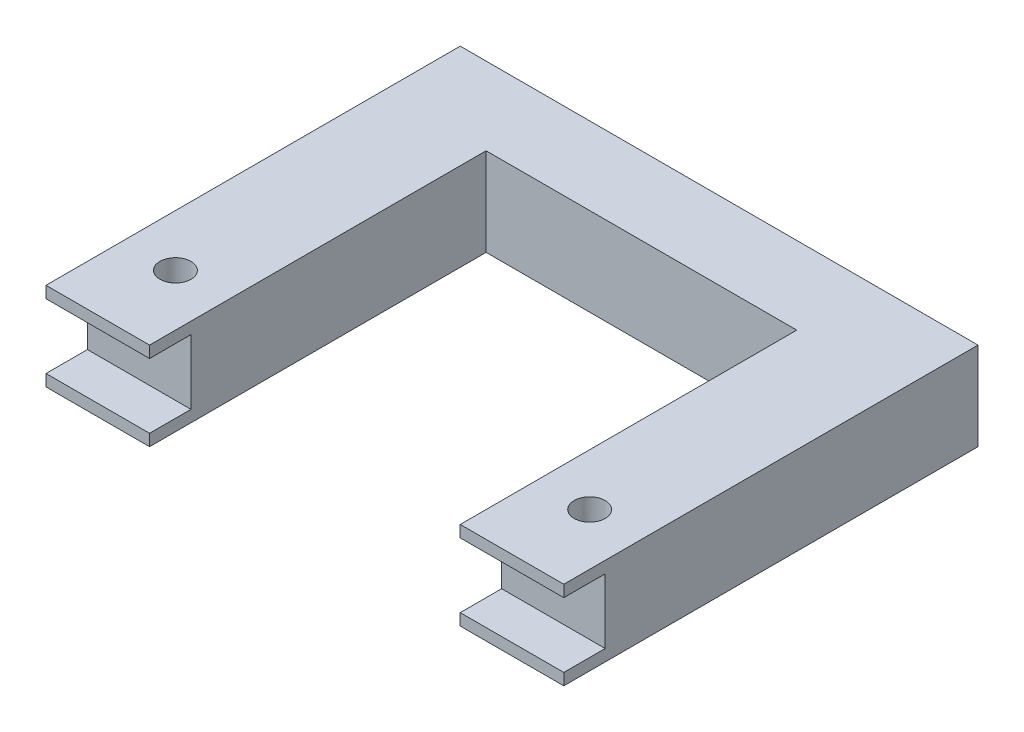
ISO-10303-21;
HEADER;
FILE_DESCRIPTION(('STEP AP214'),'2;1');
FILE_NAME('part.step','',(''),(''),'','','');
FILE_SCHEMA(('AUTOMOTIVE_DESIGN { 1 0 10303 214 1 1 1 1 }'));
ENDSEC;
DATA;
#1=APPLICATION_CONTEXT('core data for automotive mechanical design processes');
#2=APPLICATION_PROTOCOL_DEFINITION('international standard','automotive_design',2000,#1);
#3=PRODUCT_CONTEXT('',#1,'mechanical');
#4=PRODUCT('Part','Part','',(#3));
#5=PRODUCT_RELATED_PRODUCT_CATEGORY('part','',(#4));
#6=PRODUCT_DEFINITION_FORMATION('','',#4);
#7=PRODUCT_DEFINITION_CONTEXT('part definition',#1,'design');
#8=PRODUCT_DEFINITION('design','',#6,#7);
#9=PRODUCT_DEFINITION_SHAPE('','',#8);
#10=(LENGTH_UNIT() NAMED_UNIT(*) SI_UNIT(.MILLI.,.METRE.));
#11=(NAMED_UNIT(*) PLANE_ANGLE_UNIT() SI_UNIT($,.RADIAN.));
#12=(NAMED_UNIT(*) SI_UNIT($,.STERADIAN.) SOLID_ANGLE_UNIT());
#13=UNCERTAINTY_MEASURE_WITH_UNIT(LENGTH_MEASURE(1.E-05),#10,'distance_accuracy_value','');
#14=(GEOMETRIC_REPRESENTATION_CONTEXT(3) GLOBAL_UNCERTAINTY_ASSIGNED_CONTEXT((#13)) GLOBAL_UNIT_ASSIGNED_CONTEXT((#10,
#11,#12)) REPRESENTATION_CONTEXT('',''));
#15=CARTESIAN_POINT('',(0.,0.,0.));
#16=DIRECTION('',(0.,0.,1.));
#17=DIRECTION('',(1.,0.,0.));
#18=AXIS2_PLACEMENT_3D('',#15,#16,#17);
#19=CARTESIAN_POINT('',(80.,17.,0.));
#20=DIRECTION('',(0.,0.,-1.));
#21=DIRECTION('',(-1.,0.,0.));
#22=AXIS2_PLACEMENT_3D('',#19,#20,#21);
#23=PLANE('',#22);
#24=DIRECTION('',(0.,-1.,0.));
#25=VECTOR('',#24,1.);
#26=CARTESIAN_POINT('',(60.,17.,0.));
#27=LINE('',#26,#25);
#28=CARTESIAN_POINT('',(60.,17.,0.));
#29=VERTEX_POINT('',#28);
#30=CARTESIAN_POINT('',(60.,14.75,0.));
#31=VERTEX_POINT('',#30);
#32=EDGE_CURVE('E247',#29,#31,#27,.T.);
#33=ORIENTED_EDGE('',*,*,#32,.T.);
#34=DIRECTION('',(-1.,0.,0.));
#35=VECTOR('',#34,1.);
#36=CARTESIAN_POINT('',(-20.,14.75,0.));
#37=LINE('',#36,#35);
#38=CARTESIAN_POINT('',(80.,14.75,0.));
#39=VERTEX_POINT('',#38);
#40=EDGE_CURVE('E163',#39,#31,#37,.T.);
#41=ORIENTED_EDGE('',*,*,#40,.F.);
#42=DIRECTION('',(0.,-1.,0.));
#43=VECTOR('',#42,1.);
#44=CARTESIAN_POINT('',(80.,17.,0.));
#45=LINE('',#44,#43);
#46=CARTESIAN_POINT('',(80.,17.,0.));
#47=VERTEX_POINT('',#46);
#48=EDGE_CURVE('E243',#47,#39,#45,.T.);
#49=ORIENTED_EDGE('',*,*,#48,.F.);
#50=DIRECTION('',(1.,0.,0.));
#51=VECTOR('',#50,1.);
#52=CARTESIAN_POINT('',(80.,17.,0.));
#53=LINE('',#52,#51);
#54=EDGE_CURVE('E201',#29,#47,#53,.T.);
#55=ORIENTED_EDGE('',*,*,#54,.F.);
#56=EDGE_LOOP('',(#33,#41,#49,#55));
#57=FACE_BOUND('',#56,.T.);
#58=ADVANCED_FACE('F33',(#57),#23,.F.);
#59=CARTESIAN_POINT('',(0.,17.,0.));
#60=DIRECTION('',(0.,0.,-1.));
#61=DIRECTION('',(-1.,0.,0.));
#62=AXIS2_PLACEMENT_3D('',#59,#60,#61);
#63=PLANE('',#62);
#64=DIRECTION('',(0.,-1.,0.));
#65=VECTOR('',#64,1.);
#66=CARTESIAN_POINT('',(-20.,17.,0.));
#67=LINE('',#66,#65);
#68=CARTESIAN_POINT('',(-20.,17.,0.));
#69=VERTEX_POINT('',#68);
#70=CARTESIAN_POINT('',(-20.,14.75,0.));
#71=VERTEX_POINT('',#70);
#72=EDGE_CURVE('E233',#69,#71,#67,.T.);
#73=ORIENTED_EDGE('',*,*,#72,.T.);
#74=DIRECTION('',(1.,0.,0.));
#75=VECTOR('',#74,1.);
#76=CARTESIAN_POINT('',(0.,14.75,0.));
#77=LINE('',#76,#75);
#78=CARTESIAN_POINT('',(0.,14.75,0.));
#79=VERTEX_POINT('',#78);
#80=EDGE_CURVE('E11',#71,#79,#77,.T.);
#81=ORIENTED_EDGE('',*,*,#80,.T.);
#82=DIRECTION('',(0.,-1.,0.));
#83=VECTOR('',#82,1.);
#84=CARTESIAN_POINT('',(0.,17.,0.));
#85=LINE('',#84,#83);
#86=CARTESIAN_POINT('',(0.,17.,0.));
#87=VERTEX_POINT('',#86);
#88=EDGE_CURVE('E230',#87,#79,#85,.T.);
#89=ORIENTED_EDGE('',*,*,#88,.F.);
#90=DIRECTION('',(1.,0.,0.));
#91=VECTOR('',#90,1.);
#92=CARTESIAN_POINT('',(0.,17.,0.));
#93=LINE('',#92,#91);
#94=EDGE_CURVE('E209',#69,#87,#93,.T.);
#95=ORIENTED_EDGE('',*,*,#94,.F.);
#96=EDGE_LOOP('',(#73,#81,#89,#95));
#97=FACE_BOUND('',#96,.T.);
#98=ADVANCED_FACE('F281',(#97),#63,.F.);
#99=CARTESIAN_POINT('',(0.,17.,-65.));
#100=DIRECTION('',(-1.,0.,0.));
#101=DIRECTION('',(0.,0.,1.));
#102=AXIS2_PLACEMENT_3D('',#99,#100,#101);
#103=PLANE('',#102);
#104=ORIENTED_EDGE('',*,*,#88,.T.);
#105=DIRECTION('',(0.,0.,-1.));
#106=VECTOR('',#105,1.);
#107=CARTESIAN_POINT('',(0.,14.75,-65.));
#108=LINE('',#107,#106);
#109=CARTESIAN_POINT('',(0.,14.75,-8.));
#110=VERTEX_POINT('',#109);
#111=EDGE_CURVE('E185',#79,#110,#108,.T.);
#112=ORIENTED_EDGE('',*,*,#111,.T.);
#113=DIRECTION('',(0.,1.,0.));
#114=VECTOR('',#113,1.);
#115=CARTESIAN_POINT('',(0.,17.,-8.));
#116=LINE('',#115,#114);
#117=CARTESIAN_POINT('',(0.,2.25,-8.));
#118=VERTEX_POINT('',#117);
#119=EDGE_CURVE('E190',#118,#110,#116,.T.);
#120=ORIENTED_EDGE('',*,*,#119,.F.);
#121=DIRECTION('',(0.,0.,1.));
#122=VECTOR('',#121,1.);
#123=CARTESIAN_POINT('',(0.,2.25,-65.));
#124=LINE('',#123,#122);
#125=CARTESIAN_POINT('',(0.,2.25,0.));
#126=VERTEX_POINT('',#125);
#127=EDGE_CURVE('E149',#118,#126,#124,.T.);
#128=ORIENTED_EDGE('',*,*,#127,.T.);
#129=CARTESIAN_POINT('',(0.,0.,0.));
#130=VERTEX_POINT('',#129);
#131=EDGE_CURVE('E211',#126,#130,#85,.T.);
#132=ORIENTED_EDGE('',*,*,#131,.T.);
#133=DIRECTION('',(0.,0.,-1.));
#134=VECTOR('',#133,1.);
#135=CARTESIAN_POINT('',(0.,0.,-65.));
#136=LINE('',#135,#134);
#137=CARTESIAN_POINT('',(0.,0.,-65.));
#138=VERTEX_POINT('',#137);
#139=EDGE_CURVE('E192',#130,#138,#136,.T.);
#140=ORIENTED_EDGE('',*,*,#139,.T.);
#141=DIRECTION('',(0.,-1.,0.));
#142=VECTOR('',#141,1.);
#143=CARTESIAN_POINT('',(0.,17.,-65.));
#144=LINE('',#143,#142);
#145=CARTESIAN_POINT('',(0.,17.,-65.));
#146=VERTEX_POINT('',#145);
#147=EDGE_CURVE('E41',#146,#138,#144,.T.);
#148=ORIENTED_EDGE('',*,*,#147,.F.);
#149=DIRECTION('',(0.,0.,-1.));
#150=VECTOR('',#149,1.);
#151=CARTESIAN_POINT('',(0.,17.,-65.));
#152=LINE('',#151,#150);
#153=EDGE_CURVE('E193',#87,#146,#152,.T.);
#154=ORIENTED_EDGE('',*,*,#153,.F.);
#155=EDGE_LOOP('',(#104,#112,#120,#128,#132,#140,#148,#154));
#156=FACE_BOUND('',#155,.T.);
#157=ADVANCED_FACE('F35',(#156),#103,.F.);
#158=CARTESIAN_POINT('',(60.,17.,-65.));
#159=DIRECTION('',(0.,0.,-1.));
#160=DIRECTION('',(-1.,0.,0.));
#161=AXIS2_PLACEMENT_3D('',#158,#159,#160);
#162=PLANE('',#161);
#163=DIRECTION('',(1.,0.,0.));
#164=VECTOR('',#163,1.);
#165=CARTESIAN_POINT('',(60.,0.,-65.));
#166=LINE('',#165,#164);
#167=CARTESIAN_POINT('',(60.,0.,-65.));
#168=VERTEX_POINT('',#167);
#169=EDGE_CURVE('E214',#138,#168,#166,.T.);
#170=ORIENTED_EDGE('',*,*,#169,.T.);
#171=DIRECTION('',(0.,-1.,0.));
#172=VECTOR('',#171,1.);
#173=CARTESIAN_POINT('',(60.,17.,-65.));
#174=LINE('',#173,#172);
#175=CARTESIAN_POINT('',(60.,17.,-65.));
#176=VERTEX_POINT('',#175);
#177=EDGE_CURVE('E250',#176,#168,#174,.T.);
#178=ORIENTED_EDGE('',*,*,#177,.F.);
#179=DIRECTION('',(1.,0.,0.));
#180=VECTOR('',#179,1.);
#181=CARTESIAN_POINT('',(60.,17.,-65.));
#182=LINE('',#181,#180);
#183=EDGE_CURVE('E196',#146,#176,#182,.T.);
#184=ORIENTED_EDGE('',*,*,#183,.F.);
#185=ORIENTED_EDGE('',*,*,#147,.T.);
#186=EDGE_LOOP('',(#170,#178,#184,#185));
#187=FACE_BOUND('',#186,.T.);
#188=ADVANCED_FACE('F255',(#187),#162,.F.);
#189=CARTESIAN_POINT('',(60.,17.,0.));
#190=DIRECTION('',(1.,0.,0.));
#191=DIRECTION('',(0.,0.,-1.));
#192=AXIS2_PLACEMENT_3D('',#189,#190,#191);
#193=PLANE('',#192);
#194=DIRECTION('',(0.,-1.,0.));
#195=VECTOR('',#194,1.);
#196=CARTESIAN_POINT('',(60.,17.,-8.));
#197=LINE('',#196,#195);
#198=CARTESIAN_POINT('',(60.,14.75,-8.));
#199=VERTEX_POINT('',#198);
#200=CARTESIAN_POINT('',(60.,2.25,-8.));
#201=VERTEX_POINT('',#200);
#202=EDGE_CURVE('E188',#199,#201,#197,.T.);
#203=ORIENTED_EDGE('',*,*,#202,.F.);
#204=DIRECTION('',(0.,0.,1.));
#205=VECTOR('',#204,1.);
#206=CARTESIAN_POINT('',(60.,14.75,0.));
#207=LINE('',#206,#205);
#208=EDGE_CURVE('E182',#199,#31,#207,.T.);
#209=ORIENTED_EDGE('',*,*,#208,.T.);
#210=ORIENTED_EDGE('',*,*,#32,.F.);
#211=DIRECTION('',(0.,0.,1.));
#212=VECTOR('',#211,1.);
#213=CARTESIAN_POINT('',(60.,17.,0.));
#214=LINE('',#213,#212);
#215=EDGE_CURVE('E199',#176,#29,#214,.T.);
#216=ORIENTED_EDGE('',*,*,#215,.F.);
#217=ORIENTED_EDGE('',*,*,#177,.T.);
#218=DIRECTION('',(0.,0.,1.));
#219=VECTOR('',#218,1.);
#220=CARTESIAN_POINT('',(60.,0.,0.));
#221=LINE('',#220,#219);
#222=CARTESIAN_POINT('',(60.,0.,0.));
#223=VERTEX_POINT('',#222);
#224=EDGE_CURVE('E216',#168,#223,#221,.T.);
#225=ORIENTED_EDGE('',*,*,#224,.T.);
#226=CARTESIAN_POINT('',(60.,2.25,0.));
#227=VERTEX_POINT('',#226);
#228=EDGE_CURVE('E246',#227,#223,#27,.T.);
#229=ORIENTED_EDGE('',*,*,#228,.F.);
#230=DIRECTION('',(0.,0.,-1.));
#231=VECTOR('',#230,1.);
#232=CARTESIAN_POINT('',(60.,2.25,0.));
#233=LINE('',#232,#231);
#234=EDGE_CURVE('E177',#227,#201,#233,.T.);
#235=ORIENTED_EDGE('',*,*,#234,.T.);
#236=EDGE_LOOP('',(#203,#209,#210,#216,#217,#225,#229,#235));
#237=FACE_BOUND('',#236,.T.);
#238=ADVANCED_FACE('F271',(#237),#193,.F.);
#239=CARTESIAN_POINT('',(80.,2.25,0.));
#240=VERTEX_POINT('',#239);
#241=CARTESIAN_POINT('',(80.,0.,0.));
#242=VERTEX_POINT('',#241);
#243=EDGE_CURVE('E242',#240,#242,#45,.T.);
#244=ORIENTED_EDGE('',*,*,#243,.F.);
#245=DIRECTION('',(1.,0.,0.));
#246=VECTOR('',#245,1.);
#247=CARTESIAN_POINT('',(-20.,2.25,0.));
#248=LINE('',#247,#246);
#249=EDGE_CURVE('E290',#227,#240,#248,.T.);
#250=ORIENTED_EDGE('',*,*,#249,.F.);
#251=ORIENTED_EDGE('',*,*,#228,.T.);
#252=DIRECTION('',(1.,0.,0.));
#253=VECTOR('',#252,1.);
#254=CARTESIAN_POINT('',(80.,0.,0.));
#255=LINE('',#254,#253);
#256=EDGE_CURVE('E219',#223,#242,#255,.T.);
#257=ORIENTED_EDGE('',*,*,#256,.T.);
#258=EDGE_LOOP('',(#244,#250,#251,#257));
#259=FACE_BOUND('',#258,.T.);
#260=ADVANCED_FACE('F334',(#259),#23,.F.);
#261=CARTESIAN_POINT('',(80.,17.,-80.));
#262=DIRECTION('',(-1.,0.,0.));
#263=DIRECTION('',(0.,0.,1.));
#264=AXIS2_PLACEMENT_3D('',#261,#262,#263);
#265=PLANE('',#264);
#266=ORIENTED_EDGE('',*,*,#48,.T.);
#267=DIRECTION('',(0.,0.,1.));
#268=VECTOR('',#267,1.);
#269=CARTESIAN_POINT('',(80.,14.75,-8.));
#270=LINE('',#269,#268);
#271=CARTESIAN_POINT('',(80.,14.75,-8.));
#272=VERTEX_POINT('',#271);
#273=EDGE_CURVE('E171',#272,#39,#270,.T.);
#274=ORIENTED_EDGE('',*,*,#273,.F.);
#275=DIRECTION('',(0.,1.,0.));
#276=VECTOR('',#275,1.);
#277=CARTESIAN_POINT('',(80.,14.75,-8.));
#278=LINE('',#277,#276);
#279=CARTESIAN_POINT('',(80.,2.25,-7.99999999999999));
#280=VERTEX_POINT('',#279);
#281=EDGE_CURVE('E152',#280,#272,#278,.T.);
#282=ORIENTED_EDGE('',*,*,#281,.F.);
#283=DIRECTION('',(0.,0.,1.));
#284=VECTOR('',#283,1.);
#285=CARTESIAN_POINT('',(80.,2.25,-8.));
#286=LINE('',#285,#284);
#287=EDGE_CURVE('E48',#280,#240,#286,.T.);
#288=ORIENTED_EDGE('',*,*,#287,.T.);
#289=ORIENTED_EDGE('',*,*,#243,.T.);
#290=DIRECTION('',(0.,0.,-1.));
#291=VECTOR('',#290,1.);
#292=CARTESIAN_POINT('',(80.,0.,-80.));
#293=LINE('',#292,#291);
#294=CARTESIAN_POINT('',(80.,0.,-80.));
#295=VERTEX_POINT('',#294);
#296=EDGE_CURVE('E222',#242,#295,#293,.T.);
#297=ORIENTED_EDGE('',*,*,#296,.T.);
#298=DIRECTION('',(0.,-1.,0.));
#299=VECTOR('',#298,1.);
#300=CARTESIAN_POINT('',(80.,17.,-80.));
#301=LINE('',#300,#299);
#302=CARTESIAN_POINT('',(80.,17.,-80.));
#303=VERTEX_POINT('',#302);
#304=EDGE_CURVE('E239',#303,#295,#301,.T.);
#305=ORIENTED_EDGE('',*,*,#304,.F.);
#306=DIRECTION('',(0.,0.,-1.));
#307=VECTOR('',#306,1.);
#308=CARTESIAN_POINT('',(80.,17.,-80.));
#309=LINE('',#308,#307);
#310=EDGE_CURVE('E203',#47,#303,#309,.T.);
#311=ORIENTED_EDGE('',*,*,#310,.F.);
#312=EDGE_LOOP('',(#266,#274,#282,#288,#289,#297,#305,#311));
#313=FACE_BOUND('',#312,.T.);
#314=ADVANCED_FACE('F341',(#313),#265,.F.);
#315=CARTESIAN_POINT('',(-20.,17.,-80.));
#316=DIRECTION('',(0.,0.,1.));
#317=DIRECTION('',(1.,0.,0.));
#318=AXIS2_PLACEMENT_3D('',#315,#316,#317);
#319=PLANE('',#318);
#320=DIRECTION('',(-1.,0.,0.));
#321=VECTOR('',#320,1.);
#322=CARTESIAN_POINT('',(-20.,0.,-80.));
#323=LINE('',#322,#321);
#324=CARTESIAN_POINT('',(-20.,0.,-80.));
#325=VERTEX_POINT('',#324);
#326=EDGE_CURVE('E224',#295,#325,#323,.T.);
#327=ORIENTED_EDGE('',*,*,#326,.T.);
#328=DIRECTION('',(0.,-1.,0.));
#329=VECTOR('',#328,1.);
#330=CARTESIAN_POINT('',(-20.,17.,-80.));
#331=LINE('',#330,#329);
#332=CARTESIAN_POINT('',(-20.,17.,-80.));
#333=VERTEX_POINT('',#332);
#334=EDGE_CURVE('E236',#333,#325,#331,.T.);
#335=ORIENTED_EDGE('',*,*,#334,.F.);
#336=DIRECTION('',(-1.,0.,0.));
#337=VECTOR('',#336,1.);
#338=CARTESIAN_POINT('',(-20.,17.,-80.));
#339=LINE('',#338,#337);
#340=EDGE_CURVE('E205',#303,#333,#339,.T.);
#341=ORIENTED_EDGE('',*,*,#340,.F.);
#342=ORIENTED_EDGE('',*,*,#304,.T.);
#343=EDGE_LOOP('',(#327,#335,#341,#342));
#344=FACE_BOUND('',#343,.T.);
#345=ADVANCED_FACE('F347',(#344),#319,.F.);
#346=CARTESIAN_POINT('',(-20.,17.,0.));
#347=DIRECTION('',(1.,0.,0.));
#348=DIRECTION('',(0.,0.,-1.));
#349=AXIS2_PLACEMENT_3D('',#346,#347,#348);
#350=PLANE('',#349);
#351=DIRECTION('',(0.,-1.,0.));
#352=VECTOR('',#351,1.);
#353=CARTESIAN_POINT('',(-20.,14.75,-8.));
#354=LINE('',#353,#352);
#355=CARTESIAN_POINT('',(-20.,14.75,-8.));
#356=VERTEX_POINT('',#355);
#357=CARTESIAN_POINT('',(-20.,2.25,-8.));
#358=VERTEX_POINT('',#357);
#359=EDGE_CURVE('E156',#356,#358,#354,.T.);
#360=ORIENTED_EDGE('',*,*,#359,.F.);
#361=DIRECTION('',(0.,0.,1.));
#362=VECTOR('',#361,1.);
#363=CARTESIAN_POINT('',(-20.,14.75,-8.));
#364=LINE('',#363,#362);
#365=EDGE_CURVE('E180',#356,#71,#364,.T.);
#366=ORIENTED_EDGE('',*,*,#365,.T.);
#367=ORIENTED_EDGE('',*,*,#72,.F.);
#368=DIRECTION('',(0.,0.,1.));
#369=VECTOR('',#368,1.);
#370=CARTESIAN_POINT('',(-20.,17.,0.));
#371=LINE('',#370,#369);
#372=EDGE_CURVE('E207',#333,#69,#371,.T.);
#373=ORIENTED_EDGE('',*,*,#372,.F.);
#374=ORIENTED_EDGE('',*,*,#334,.T.);
#375=DIRECTION('',(0.,0.,1.));
#376=VECTOR('',#375,1.);
#377=CARTESIAN_POINT('',(-20.,0.,0.));
#378=LINE('',#377,#376);
#379=CARTESIAN_POINT('',(-20.,0.,0.));
#380=VERTEX_POINT('',#379);
#381=EDGE_CURVE('E226',#325,#380,#378,.T.);
#382=ORIENTED_EDGE('',*,*,#381,.T.);
#383=CARTESIAN_POINT('',(-20.,2.25,0.));
#384=VERTEX_POINT('',#383);
#385=EDGE_CURVE('E168',#384,#380,#67,.T.);
#386=ORIENTED_EDGE('',*,*,#385,.F.);
#387=DIRECTION('',(0.,0.,1.));
#388=VECTOR('',#387,1.);
#389=CARTESIAN_POINT('',(-20.,2.25,-8.));
#390=LINE('',#389,#388);
#391=EDGE_CURVE('E56',#358,#384,#390,.T.);
#392=ORIENTED_EDGE('',*,*,#391,.F.);
#393=EDGE_LOOP('',(#360,#366,#367,#373,#374,#382,#386,#392));
#394=FACE_BOUND('',#393,.T.);
#395=ADVANCED_FACE('F166',(#394),#350,.F.);
#396=ORIENTED_EDGE('',*,*,#131,.F.);
#397=EDGE_CURVE('E289',#384,#126,#248,.T.);
#398=ORIENTED_EDGE('',*,*,#397,.F.);
#399=ORIENTED_EDGE('',*,*,#385,.T.);
#400=DIRECTION('',(1.,0.,0.));
#401=VECTOR('',#400,1.);
#402=CARTESIAN_POINT('',(0.,0.,0.));
#403=LINE('',#402,#401);
#404=EDGE_CURVE('E197',#380,#130,#403,.T.);
#405=ORIENTED_EDGE('',*,*,#404,.T.);
#406=EDGE_LOOP('',(#396,#398,#399,#405));
#407=FACE_BOUND('',#406,.T.);
#408=ADVANCED_FACE('F311',(#407),#63,.F.);
#409=CARTESIAN_POINT('',(0.,17.,0.));
#410=DIRECTION('',(0.,-1.,0.));
#411=DIRECTION('',(0.,0.,-1.));
#412=AXIS2_PLACEMENT_3D('',#409,#410,#411);
#413=PLANE('',#412);
#414=CARTESIAN_POINT('',(-10.,17.,-15.));
#415=DIRECTION('',(0.,1.,0.));
#416=DIRECTION('',(0.,0.,1.));
#417=AXIS2_PLACEMENT_3D('',#414,#415,#416);
#418=CIRCLE('',#417,3.);
#419=CARTESIAN_POINT('',(-10.,17.,-12.));
#420=VERTEX_POINT('',#419);
#421=EDGE_CURVE('E296',#420,#420,#418,.T.);
#422=ORIENTED_EDGE('',*,*,#421,.F.);
#423=EDGE_LOOP('',(#422));
#424=FACE_BOUND('',#423,.T.);
#425=CARTESIAN_POINT('',(70.,17.,-15.));
#426=DIRECTION('',(0.,1.,0.));
#427=DIRECTION('',(0.,0.,1.));
#428=AXIS2_PLACEMENT_3D('',#425,#426,#427);
#429=CIRCLE('',#428,3.00000000000001);
#430=CARTESIAN_POINT('',(70.,17.,-12.));
#431=VERTEX_POINT('',#430);
#432=EDGE_CURVE('E297',#431,#431,#429,.T.);
#433=ORIENTED_EDGE('',*,*,#432,.F.);
#434=EDGE_LOOP('',(#433));
#435=FACE_BOUND('',#434,.T.);
#436=ORIENTED_EDGE('',*,*,#153,.T.);
#437=ORIENTED_EDGE('',*,*,#183,.T.);
#438=ORIENTED_EDGE('',*,*,#215,.T.);
#439=ORIENTED_EDGE('',*,*,#54,.T.);
#440=ORIENTED_EDGE('',*,*,#310,.T.);
#441=ORIENTED_EDGE('',*,*,#340,.T.);
#442=ORIENTED_EDGE('',*,*,#372,.T.);
#443=ORIENTED_EDGE('',*,*,#94,.T.);
#444=EDGE_LOOP('',(#436,#437,#438,#439,#440,#441,#442,#443));
#445=FACE_BOUND('',#444,.T.);
#446=ADVANCED_FACE('F276',(#424,#435,#445),#413,.F.);
#447=CARTESIAN_POINT('',(0.,0.,0.));
#448=DIRECTION('',(0.,-1.,0.));
#449=DIRECTION('',(0.,0.,-1.));
#450=AXIS2_PLACEMENT_3D('',#447,#448,#449);
#451=PLANE('',#450);
#452=CARTESIAN_POINT('',(-10.,0.,-15.));
#453=DIRECTION('',(0.,-1.,0.));
#454=DIRECTION('',(0.,0.,-1.));
#455=AXIS2_PLACEMENT_3D('',#452,#453,#454);
#456=CIRCLE('',#455,3.);
#457=CARTESIAN_POINT('',(-10.,0.,-18.));
#458=VERTEX_POINT('',#457);
#459=EDGE_CURVE('E300',#458,#458,#456,.F.);
#460=ORIENTED_EDGE('',*,*,#459,.T.);
#461=EDGE_LOOP('',(#460));
#462=FACE_BOUND('',#461,.T.);
#463=CARTESIAN_POINT('',(70.,0.,-15.));
#464=DIRECTION('',(0.,-1.,0.));
#465=DIRECTION('',(0.,0.,-1.));
#466=AXIS2_PLACEMENT_3D('',#463,#464,#465);
#467=CIRCLE('',#466,3.00000000000001);
#468=CARTESIAN_POINT('',(70.,0.,-18.));
#469=VERTEX_POINT('',#468);
#470=EDGE_CURVE('E293',#469,#469,#467,.F.);
#471=ORIENTED_EDGE('',*,*,#470,.T.);
#472=EDGE_LOOP('',(#471));
#473=FACE_BOUND('',#472,.T.);
#474=ORIENTED_EDGE('',*,*,#139,.F.);
#475=ORIENTED_EDGE('',*,*,#404,.F.);
#476=ORIENTED_EDGE('',*,*,#381,.F.);
#477=ORIENTED_EDGE('',*,*,#326,.F.);
#478=ORIENTED_EDGE('',*,*,#296,.F.);
#479=ORIENTED_EDGE('',*,*,#256,.F.);
#480=ORIENTED_EDGE('',*,*,#224,.F.);
#481=ORIENTED_EDGE('',*,*,#169,.F.);
#482=EDGE_LOOP('',(#474,#475,#476,#477,#478,#479,#480,#481));
#483=FACE_BOUND('',#482,.T.);
#484=ADVANCED_FACE('F263',(#462,#473,#483),#451,.T.);
#485=CARTESIAN_POINT('',(-20.,14.75,-8.));
#486=DIRECTION('',(0.,1.,0.));
#487=DIRECTION('',(0.,0.,1.));
#488=AXIS2_PLACEMENT_3D('',#485,#486,#487);
#489=PLANE('',#488);
#490=ORIENTED_EDGE('',*,*,#80,.F.);
#491=ORIENTED_EDGE('',*,*,#365,.F.);
#492=DIRECTION('',(-1.,0.,0.));
#493=VECTOR('',#492,1.);
#494=CARTESIAN_POINT('',(-20.,14.75,-8.));
#495=LINE('',#494,#493);
#496=EDGE_CURVE('E159',#110,#356,#495,.T.);
#497=ORIENTED_EDGE('',*,*,#496,.F.);
#498=ORIENTED_EDGE('',*,*,#111,.F.);
#499=EDGE_LOOP('',(#490,#491,#497,#498));
#500=FACE_BOUND('',#499,.T.);
#501=ADVANCED_FACE('F284',(#500),#489,.F.);
#502=CARTESIAN_POINT('',(-20.,2.25,-8.));
#503=DIRECTION('',(0.,-1.,0.));
#504=DIRECTION('',(0.,0.,-1.));
#505=AXIS2_PLACEMENT_3D('',#502,#503,#504);
#506=PLANE('',#505);
#507=DIRECTION('',(1.,0.,0.));
#508=VECTOR('',#507,1.);
#509=CARTESIAN_POINT('',(-20.,2.25,-8.));
#510=LINE('',#509,#508);
#511=EDGE_CURVE('E145',#358,#118,#510,.T.);
#512=ORIENTED_EDGE('',*,*,#511,.F.);
#513=ORIENTED_EDGE('',*,*,#391,.T.);
#514=ORIENTED_EDGE('',*,*,#397,.T.);
#515=ORIENTED_EDGE('',*,*,#127,.F.);
#516=EDGE_LOOP('',(#512,#513,#514,#515));
#517=FACE_BOUND('',#516,.T.);
#518=ADVANCED_FACE('F147',(#517),#506,.F.);
#519=CARTESIAN_POINT('',(0.,0.,-8.));
#520=DIRECTION('',(0.,0.,1.));
#521=DIRECTION('',(1.,0.,0.));
#522=AXIS2_PLACEMENT_3D('',#519,#520,#521);
#523=PLANE('',#522);
#524=ORIENTED_EDGE('',*,*,#119,.T.);
#525=ORIENTED_EDGE('',*,*,#496,.T.);
#526=ORIENTED_EDGE('',*,*,#359,.T.);
#527=ORIENTED_EDGE('',*,*,#511,.T.);
#528=EDGE_LOOP('',(#524,#525,#526,#527));
#529=FACE_BOUND('',#528,.T.);
#530=ADVANCED_FACE('F157',(#529),#523,.T.);
#531=ORIENTED_EDGE('',*,*,#202,.T.);
#532=EDGE_CURVE('E153',#201,#280,#510,.T.);
#533=ORIENTED_EDGE('',*,*,#532,.T.);
#534=ORIENTED_EDGE('',*,*,#281,.T.);
#535=EDGE_CURVE('E169',#272,#199,#495,.T.);
#536=ORIENTED_EDGE('',*,*,#535,.T.);
#537=EDGE_LOOP('',(#531,#533,#534,#536));
#538=FACE_BOUND('',#537,.T.);
#539=ADVANCED_FACE('F356',(#538),#523,.T.);
#540=ORIENTED_EDGE('',*,*,#535,.F.);
#541=ORIENTED_EDGE('',*,*,#273,.T.);
#542=ORIENTED_EDGE('',*,*,#40,.T.);
#543=ORIENTED_EDGE('',*,*,#208,.F.);
#544=EDGE_LOOP('',(#540,#541,#542,#543));
#545=FACE_BOUND('',#544,.T.);
#546=ADVANCED_FACE('F329',(#545),#489,.F.);
#547=ORIENTED_EDGE('',*,*,#249,.T.);
#548=ORIENTED_EDGE('',*,*,#287,.F.);
#549=ORIENTED_EDGE('',*,*,#532,.F.);
#550=ORIENTED_EDGE('',*,*,#234,.F.);
#551=EDGE_LOOP('',(#547,#548,#549,#550));
#552=FACE_BOUND('',#551,.T.);
#553=ADVANCED_FACE('F318',(#552),#506,.F.);
#554=CARTESIAN_POINT('',(70.,-8.48528137423859,-15.));
#555=DIRECTION('',(0.,1.,0.));
#556=DIRECTION('',(0.,0.,1.));
#557=AXIS2_PLACEMENT_3D('',#554,#555,#556);
#558=CYLINDRICAL_SURFACE('',#557,3.00000000000001);
#559=ORIENTED_EDGE('',*,*,#432,.T.);
#560=EDGE_LOOP('',(#559));
#561=FACE_BOUND('',#560,.T.);
#562=ORIENTED_EDGE('',*,*,#470,.F.);
#563=EDGE_LOOP('',(#562));
#564=FACE_BOUND('',#563,.T.);
#565=ADVANCED_FACE('F315',(#561,#564),#558,.F.);
#566=CARTESIAN_POINT('',(-10.,-8.48528137423859,-15.));
#567=DIRECTION('',(0.,1.,0.));
#568=DIRECTION('',(0.,0.,1.));
#569=AXIS2_PLACEMENT_3D('',#566,#567,#568);
#570=CYLINDRICAL_SURFACE('',#569,3.);
#571=ORIENTED_EDGE('',*,*,#421,.T.);
#572=EDGE_LOOP('',(#571));
#573=FACE_BOUND('',#572,.T.);
#574=ORIENTED_EDGE('',*,*,#459,.F.);
#575=EDGE_LOOP('',(#574));
#576=FACE_BOUND('',#575,.T.);
#577=ADVANCED_FACE('F306',(#573,#576),#570,.F.);
#578=CLOSED_SHELL('',(#58,#98,#157,#188,#238,#260,#314,#345,#395,#408,#446,#484,#501,#518,#530,
#539,#546,#553,#565,#577));
#579=MANIFOLD_SOLID_BREP('B2',#578);
#580=ADVANCED_BREP_SHAPE_REPRESENTATION('',(#18,#579),#14);
#581=SHAPE_DEFINITION_REPRESENTATION(#9,#580);
ENDSEC;
END-ISO-10303-21;
